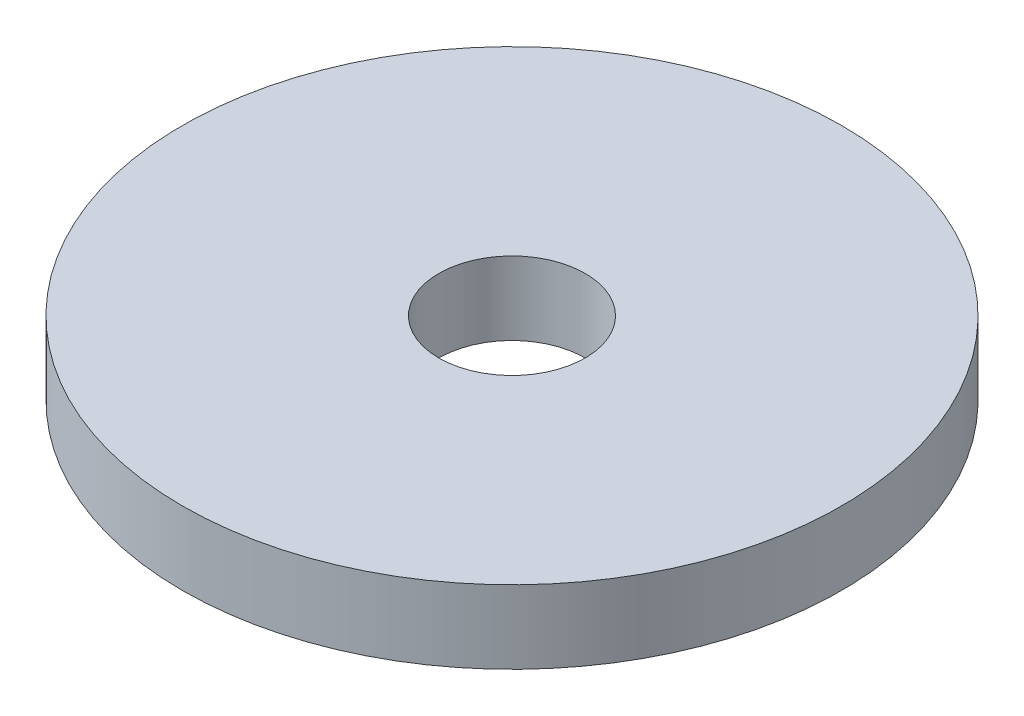
ISO-10303-21;
HEADER;
FILE_DESCRIPTION(('STEP AP214'),'2;1');
FILE_NAME('part.step','',(''),(''),'','','');
FILE_SCHEMA(('AUTOMOTIVE_DESIGN { 1 0 10303 214 1 1 1 1 }'));
ENDSEC;
DATA;
#1=APPLICATION_CONTEXT('core data for automotive mechanical design processes');
#2=APPLICATION_PROTOCOL_DEFINITION('international standard','automotive_design',2000,#1);
#3=PRODUCT_CONTEXT('',#1,'mechanical');
#4=PRODUCT('Part','Part','',(#3));
#5=PRODUCT_RELATED_PRODUCT_CATEGORY('part','',(#4));
#6=PRODUCT_DEFINITION_FORMATION('','',#4);
#7=PRODUCT_DEFINITION_CONTEXT('part definition',#1,'design');
#8=PRODUCT_DEFINITION('design','',#6,#7);
#9=PRODUCT_DEFINITION_SHAPE('','',#8);
#10=(LENGTH_UNIT() NAMED_UNIT(*) SI_UNIT(.MILLI.,.METRE.));
#11=(NAMED_UNIT(*) PLANE_ANGLE_UNIT() SI_UNIT($,.RADIAN.));
#12=(NAMED_UNIT(*) SI_UNIT($,.STERADIAN.) SOLID_ANGLE_UNIT());
#13=UNCERTAINTY_MEASURE_WITH_UNIT(LENGTH_MEASURE(1.E-05),#10,'distance_accuracy_value','');
#14=(GEOMETRIC_REPRESENTATION_CONTEXT(3) GLOBAL_UNCERTAINTY_ASSIGNED_CONTEXT((#13)) GLOBAL_UNIT_ASSIGNED_CONTEXT((#10,
#11,#12)) REPRESENTATION_CONTEXT('',''));
#15=CARTESIAN_POINT('',(0.,0.,0.));
#16=DIRECTION('',(0.,0.,1.));
#17=DIRECTION('',(1.,0.,0.));
#18=AXIS2_PLACEMENT_3D('',#15,#16,#17);
#19=CARTESIAN_POINT('',(0.,2.,0.));
#20=DIRECTION('',(0.,1.,0.));
#21=DIRECTION('',(0.,0.,1.));
#22=AXIS2_PLACEMENT_3D('',#19,#20,#21);
#23=PLANE('',#22);
#24=CARTESIAN_POINT('',(0.,2.,0.));
#25=DIRECTION('',(0.,1.,0.));
#26=DIRECTION('',(0.,0.,1.));
#27=AXIS2_PLACEMENT_3D('',#24,#25,#26);
#28=CIRCLE('',#27,9.);
#29=CARTESIAN_POINT('',(0.,2.,9.));
#30=VERTEX_POINT('',#29);
#31=EDGE_CURVE('E10',#30,#30,#28,.T.);
#32=ORIENTED_EDGE('',*,*,#31,.T.);
#33=EDGE_LOOP('',(#32));
#34=FACE_BOUND('',#33,.T.);
#35=CARTESIAN_POINT('',(0.,2.,0.));
#36=DIRECTION('',(0.,1.,0.));
#37=DIRECTION('',(0.,0.,1.));
#38=AXIS2_PLACEMENT_3D('',#35,#36,#37);
#39=CIRCLE('',#38,2.);
#40=CARTESIAN_POINT('',(0.,2.,2.));
#41=VERTEX_POINT('',#40);
#42=EDGE_CURVE('E44',#41,#41,#39,.T.);
#43=ORIENTED_EDGE('',*,*,#42,.F.);
#44=EDGE_LOOP('',(#43));
#45=FACE_BOUND('',#44,.T.);
#46=ADVANCED_FACE('F33',(#34,#45),#23,.T.);
#47=CARTESIAN_POINT('',(0.,0.,0.));
#48=DIRECTION('',(0.,1.,0.));
#49=DIRECTION('',(0.,0.,1.));
#50=AXIS2_PLACEMENT_3D('',#47,#48,#49);
#51=PLANE('',#50);
#52=CARTESIAN_POINT('',(0.,0.,0.));
#53=DIRECTION('',(0.,1.,0.));
#54=DIRECTION('',(0.,0.,1.));
#55=AXIS2_PLACEMENT_3D('',#52,#53,#54);
#56=CIRCLE('',#55,9.);
#57=CARTESIAN_POINT('',(0.,0.,9.));
#58=VERTEX_POINT('',#57);
#59=EDGE_CURVE('E37',#58,#58,#56,.T.);
#60=ORIENTED_EDGE('',*,*,#59,.F.);
#61=EDGE_LOOP('',(#60));
#62=FACE_BOUND('',#61,.T.);
#63=CARTESIAN_POINT('',(0.,0.,0.));
#64=DIRECTION('',(0.,1.,0.));
#65=DIRECTION('',(0.,0.,1.));
#66=AXIS2_PLACEMENT_3D('',#63,#64,#65);
#67=CIRCLE('',#66,2.);
#68=CARTESIAN_POINT('',(0.,0.,2.));
#69=VERTEX_POINT('',#68);
#70=EDGE_CURVE('E46',#69,#69,#67,.T.);
#71=ORIENTED_EDGE('',*,*,#70,.T.);
#72=EDGE_LOOP('',(#71));
#73=FACE_BOUND('',#72,.T.);
#74=ADVANCED_FACE('F56',(#62,#73),#51,.F.);
#75=CARTESIAN_POINT('',(0.,2.,0.));
#76=DIRECTION('',(0.,-1.,0.));
#77=DIRECTION('',(0.,0.,-1.));
#78=AXIS2_PLACEMENT_3D('',#75,#76,#77);
#79=CYLINDRICAL_SURFACE('',#78,9.);
#80=ORIENTED_EDGE('',*,*,#31,.F.);
#81=EDGE_LOOP('',(#80));
#82=FACE_BOUND('',#81,.T.);
#83=ORIENTED_EDGE('',*,*,#59,.T.);
#84=EDGE_LOOP('',(#83));
#85=FACE_BOUND('',#84,.T.);
#86=ADVANCED_FACE('F35',(#82,#85),#79,.T.);
#87=CARTESIAN_POINT('',(0.,2.,0.));
#88=DIRECTION('',(0.,-1.,0.));
#89=DIRECTION('',(0.,0.,-1.));
#90=AXIS2_PLACEMENT_3D('',#87,#88,#89);
#91=CYLINDRICAL_SURFACE('',#90,2.);
#92=ORIENTED_EDGE('',*,*,#42,.T.);
#93=EDGE_LOOP('',(#92));
#94=FACE_BOUND('',#93,.T.);
#95=ORIENTED_EDGE('',*,*,#70,.F.);
#96=EDGE_LOOP('',(#95));
#97=FACE_BOUND('',#96,.T.);
#98=ADVANCED_FACE('F52',(#94,#97),#91,.F.);
#99=CLOSED_SHELL('',(#46,#74,#86,#98));
#100=MANIFOLD_SOLID_BREP('B2',#99);
#101=ADVANCED_BREP_SHAPE_REPRESENTATION('',(#18,#100),#14);
#102=SHAPE_DEFINITION_REPRESENTATION(#9,#101);
ENDSEC;
END-ISO-10303-21;
